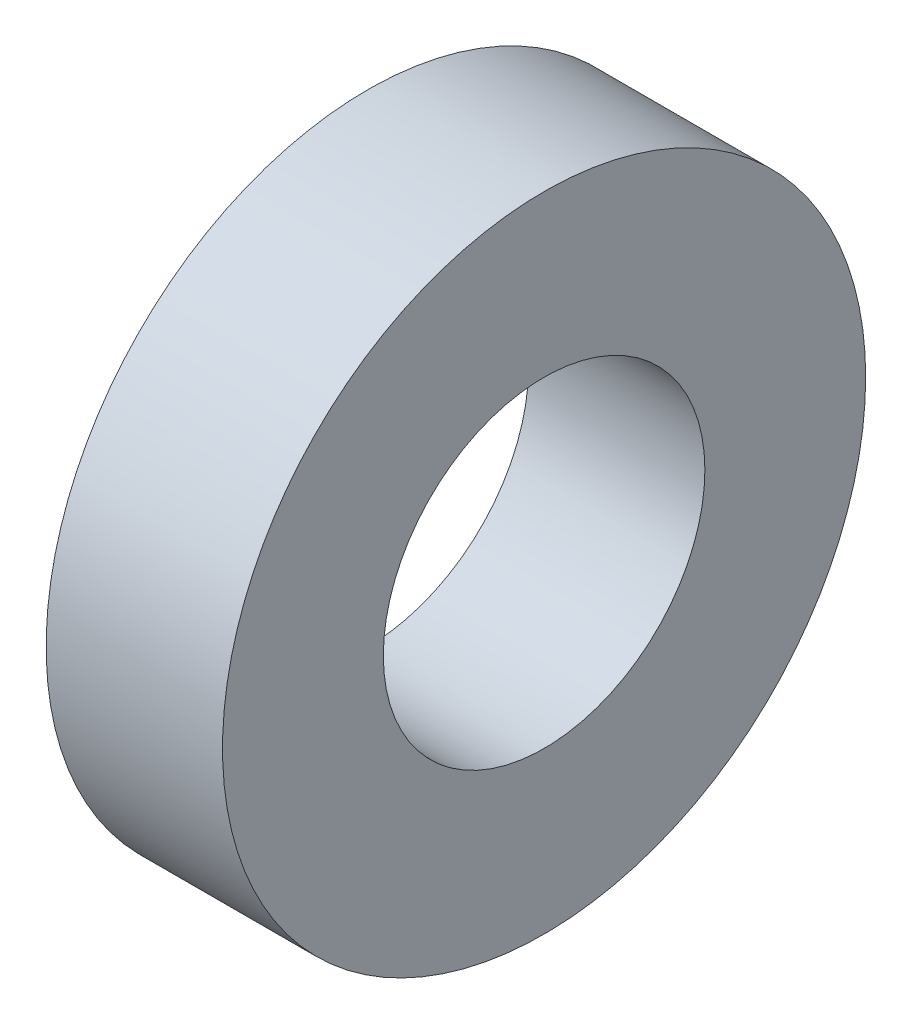
ISO-10303-21;
HEADER;
FILE_DESCRIPTION(('STEP AP214'),'2;1');
FILE_NAME('part.step','',(''),(''),'','','');
FILE_SCHEMA(('AUTOMOTIVE_DESIGN { 1 0 10303 214 1 1 1 1 }'));
ENDSEC;
DATA;
#1=APPLICATION_CONTEXT('core data for automotive mechanical design processes');
#2=APPLICATION_PROTOCOL_DEFINITION('international standard','automotive_design',2000,#1);
#3=PRODUCT_CONTEXT('',#1,'mechanical');
#4=PRODUCT('Part','Part','',(#3));
#5=PRODUCT_RELATED_PRODUCT_CATEGORY('part','',(#4));
#6=PRODUCT_DEFINITION_FORMATION('','',#4);
#7=PRODUCT_DEFINITION_CONTEXT('part definition',#1,'design');
#8=PRODUCT_DEFINITION('design','',#6,#7);
#9=PRODUCT_DEFINITION_SHAPE('','',#8);
#10=(LENGTH_UNIT() NAMED_UNIT(*) SI_UNIT(.MILLI.,.METRE.));
#11=(NAMED_UNIT(*) PLANE_ANGLE_UNIT() SI_UNIT($,.RADIAN.));
#12=(NAMED_UNIT(*) SI_UNIT($,.STERADIAN.) SOLID_ANGLE_UNIT());
#13=UNCERTAINTY_MEASURE_WITH_UNIT(LENGTH_MEASURE(1.E-05),#10,'distance_accuracy_value','');
#14=(GEOMETRIC_REPRESENTATION_CONTEXT(3) GLOBAL_UNCERTAINTY_ASSIGNED_CONTEXT((#13)) GLOBAL_UNIT_ASSIGNED_CONTEXT((#10,
#11,#12)) REPRESENTATION_CONTEXT('',''));
#15=CARTESIAN_POINT('',(0.,0.,0.));
#16=DIRECTION('',(0.,0.,1.));
#17=DIRECTION('',(1.,0.,0.));
#18=AXIS2_PLACEMENT_3D('',#15,#16,#17);
#19=CARTESIAN_POINT('',(6.96595,0.,0.));
#20=DIRECTION('',(1.,0.,0.));
#21=DIRECTION('',(0.,0.,-1.));
#22=AXIS2_PLACEMENT_3D('',#19,#20,#21);
#23=PLANE('',#22);
#24=CARTESIAN_POINT('',(6.96595,0.,0.));
#25=DIRECTION('',(1.,0.,0.));
#26=DIRECTION('',(0.,0.,-1.));
#27=AXIS2_PLACEMENT_3D('',#24,#25,#26);
#28=CIRCLE('',#27,12.7);
#29=CARTESIAN_POINT('',(6.96595,0.,-12.7));
#30=VERTEX_POINT('',#29);
#31=EDGE_CURVE('E10',#30,#30,#28,.T.);
#32=ORIENTED_EDGE('',*,*,#31,.T.);
#33=EDGE_LOOP('',(#32));
#34=FACE_BOUND('',#33,.T.);
#35=CARTESIAN_POINT('',(6.96595,0.,0.));
#36=DIRECTION('',(1.,0.,0.));
#37=DIRECTION('',(0.,0.,-1.));
#38=AXIS2_PLACEMENT_3D('',#35,#36,#37);
#39=CIRCLE('',#38,6.35);
#40=CARTESIAN_POINT('',(6.96595,0.,-6.35));
#41=VERTEX_POINT('',#40);
#42=EDGE_CURVE('E42',#41,#41,#39,.T.);
#43=ORIENTED_EDGE('',*,*,#42,.F.);
#44=EDGE_LOOP('',(#43));
#45=FACE_BOUND('',#44,.T.);
#46=ADVANCED_FACE('F31',(#34,#45),#23,.T.);
#47=CARTESIAN_POINT('',(0.,0.,0.));
#48=DIRECTION('',(1.,0.,0.));
#49=DIRECTION('',(0.,0.,-1.));
#50=AXIS2_PLACEMENT_3D('',#47,#48,#49);
#51=PLANE('',#50);
#52=CARTESIAN_POINT('',(0.,0.,0.));
#53=DIRECTION('',(1.,0.,0.));
#54=DIRECTION('',(0.,0.,-1.));
#55=AXIS2_PLACEMENT_3D('',#52,#53,#54);
#56=CIRCLE('',#55,12.7);
#57=CARTESIAN_POINT('',(0.,0.,-12.7));
#58=VERTEX_POINT('',#57);
#59=EDGE_CURVE('E35',#58,#58,#56,.T.);
#60=ORIENTED_EDGE('',*,*,#59,.F.);
#61=EDGE_LOOP('',(#60));
#62=FACE_BOUND('',#61,.T.);
#63=CARTESIAN_POINT('',(0.,0.,0.));
#64=DIRECTION('',(1.,0.,0.));
#65=DIRECTION('',(0.,0.,-1.));
#66=AXIS2_PLACEMENT_3D('',#63,#64,#65);
#67=CIRCLE('',#66,6.35);
#68=CARTESIAN_POINT('',(0.,0.,-6.35));
#69=VERTEX_POINT('',#68);
#70=EDGE_CURVE('E44',#69,#69,#67,.T.);
#71=ORIENTED_EDGE('',*,*,#70,.T.);
#72=EDGE_LOOP('',(#71));
#73=FACE_BOUND('',#72,.T.);
#74=ADVANCED_FACE('F54',(#62,#73),#51,.F.);
#75=CARTESIAN_POINT('',(6.96595,0.,0.));
#76=DIRECTION('',(-1.,0.,0.));
#77=DIRECTION('',(0.,0.,1.));
#78=AXIS2_PLACEMENT_3D('',#75,#76,#77);
#79=CYLINDRICAL_SURFACE('',#78,12.7);
#80=ORIENTED_EDGE('',*,*,#31,.F.);
#81=EDGE_LOOP('',(#80));
#82=FACE_BOUND('',#81,.T.);
#83=ORIENTED_EDGE('',*,*,#59,.T.);
#84=EDGE_LOOP('',(#83));
#85=FACE_BOUND('',#84,.T.);
#86=ADVANCED_FACE('F33',(#82,#85),#79,.T.);
#87=CARTESIAN_POINT('',(6.96595,0.,0.));
#88=DIRECTION('',(-1.,0.,0.));
#89=DIRECTION('',(0.,0.,1.));
#90=AXIS2_PLACEMENT_3D('',#87,#88,#89);
#91=CYLINDRICAL_SURFACE('',#90,6.35);
#92=ORIENTED_EDGE('',*,*,#42,.T.);
#93=EDGE_LOOP('',(#92));
#94=FACE_BOUND('',#93,.T.);
#95=ORIENTED_EDGE('',*,*,#70,.F.);
#96=EDGE_LOOP('',(#95));
#97=FACE_BOUND('',#96,.T.);
#98=ADVANCED_FACE('F50',(#94,#97),#91,.F.);
#99=CLOSED_SHELL('',(#46,#74,#86,#98));
#100=MANIFOLD_SOLID_BREP('B2',#99);
#101=ADVANCED_BREP_SHAPE_REPRESENTATION('',(#18,#100),#14);
#102=SHAPE_DEFINITION_REPRESENTATION(#9,#101);
ENDSEC;
END-ISO-10303-21;
